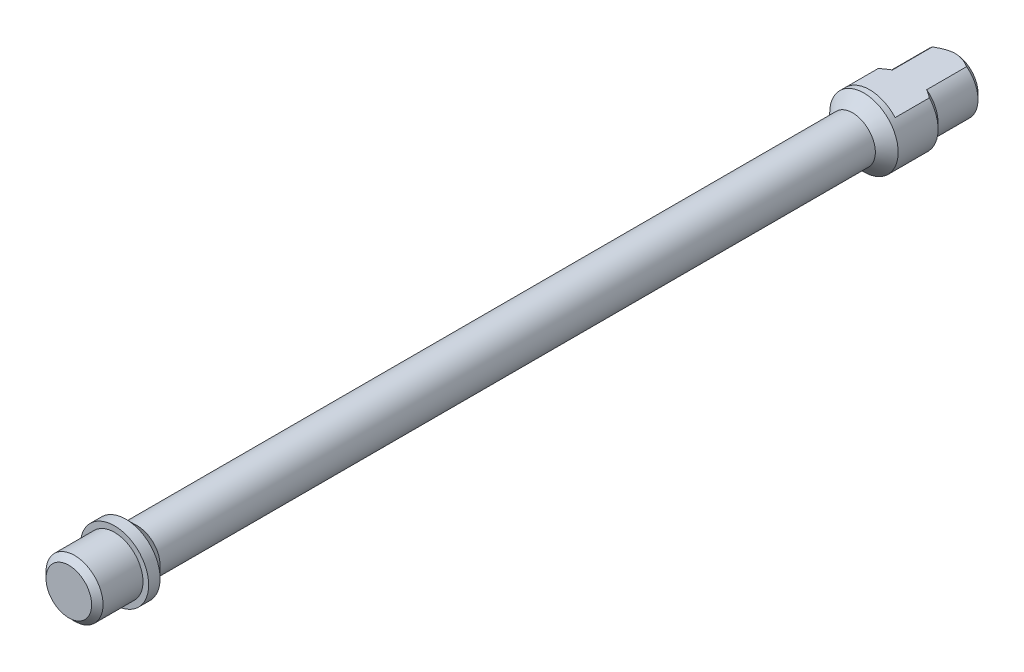
ISO-10303-21;
HEADER;
FILE_DESCRIPTION(('STEP AP214'),'2;1');
FILE_NAME('part.step','',(''),(''),'','','');
FILE_SCHEMA(('AUTOMOTIVE_DESIGN { 1 0 10303 214 1 1 1 1 }'));
ENDSEC;
DATA;
#1=APPLICATION_CONTEXT('core data for automotive mechanical design processes');
#2=APPLICATION_PROTOCOL_DEFINITION('international standard','automotive_design',2000,#1);
#3=PRODUCT_CONTEXT('',#1,'mechanical');
#4=PRODUCT('Part','Part','',(#3));
#5=PRODUCT_RELATED_PRODUCT_CATEGORY('part','',(#4));
#6=PRODUCT_DEFINITION_FORMATION('','',#4);
#7=PRODUCT_DEFINITION_CONTEXT('part definition',#1,'design');
#8=PRODUCT_DEFINITION('design','',#6,#7);
#9=PRODUCT_DEFINITION_SHAPE('','',#8);
#10=(LENGTH_UNIT() NAMED_UNIT(*) SI_UNIT(.MILLI.,.METRE.));
#11=(NAMED_UNIT(*) PLANE_ANGLE_UNIT() SI_UNIT($,.RADIAN.));
#12=(NAMED_UNIT(*) SI_UNIT($,.STERADIAN.) SOLID_ANGLE_UNIT());
#13=UNCERTAINTY_MEASURE_WITH_UNIT(LENGTH_MEASURE(1.E-05),#10,'distance_accuracy_value','');
#14=(GEOMETRIC_REPRESENTATION_CONTEXT(3) GLOBAL_UNCERTAINTY_ASSIGNED_CONTEXT((#13)) GLOBAL_UNIT_ASSIGNED_CONTEXT((#10,
#11,#12)) REPRESENTATION_CONTEXT('',''));
#15=CARTESIAN_POINT('',(0.,0.,0.));
#16=DIRECTION('',(0.,0.,1.));
#17=DIRECTION('',(1.,0.,0.));
#18=AXIS2_PLACEMENT_3D('',#15,#16,#17);
#19=CARTESIAN_POINT('',(0.,0.,33.35));
#20=DIRECTION('',(0.,0.,1.));
#21=DIRECTION('',(1.,0.,0.));
#22=AXIS2_PLACEMENT_3D('',#19,#20,#21);
#23=PLANE('',#22);
#24=CARTESIAN_POINT('',(0.,0.,33.35));
#25=DIRECTION('',(0.,0.,1.));
#26=DIRECTION('',(1.,0.,0.));
#27=AXIS2_PLACEMENT_3D('',#24,#25,#26);
#28=CIRCLE('',#27,3.);
#29=CARTESIAN_POINT('',(3.,0.,33.35));
#30=VERTEX_POINT('',#29);
#31=EDGE_CURVE('E95',#30,#30,#28,.T.);
#32=ORIENTED_EDGE('',*,*,#31,.T.);
#33=EDGE_LOOP('',(#32));
#34=FACE_BOUND('',#33,.T.);
#35=CARTESIAN_POINT('',(0.,0.,33.35));
#36=DIRECTION('',(0.,0.,1.));
#37=DIRECTION('',(1.,0.,0.));
#38=AXIS2_PLACEMENT_3D('',#35,#36,#37);
#39=CIRCLE('',#38,2.5);
#40=CARTESIAN_POINT('',(2.5,0.,33.35));
#41=VERTEX_POINT('',#40);
#42=EDGE_CURVE('E180',#41,#41,#39,.T.);
#43=ORIENTED_EDGE('',*,*,#42,.F.);
#44=EDGE_LOOP('',(#43));
#45=FACE_BOUND('',#44,.T.);
#46=ADVANCED_FACE('F35',(#34,#45),#23,.T.);
#47=CARTESIAN_POINT('',(0.,0.,32.35));
#48=DIRECTION('',(0.,0.,-1.));
#49=DIRECTION('',(-1.,0.,0.));
#50=AXIS2_PLACEMENT_3D('',#47,#48,#49);
#51=CYLINDRICAL_SURFACE('',#50,2.);
#52=CARTESIAN_POINT('',(0.,0.,-31.35));
#53=DIRECTION('',(0.,0.,-1.));
#54=DIRECTION('',(-1.,0.,0.));
#55=AXIS2_PLACEMENT_3D('',#52,#53,#54);
#56=CIRCLE('',#55,2.);
#57=CARTESIAN_POINT('',(-2.,0.,-31.35));
#58=VERTEX_POINT('',#57);
#59=EDGE_CURVE('E11',#58,#58,#56,.F.);
#60=CARTESIAN_POINT('',(0.,0.,31.35));
#61=DIRECTION('',(0.,0.,1.));
#62=DIRECTION('',(1.,0.,0.));
#63=AXIS2_PLACEMENT_3D('',#60,#61,#62);
#64=CIRCLE('',#63,2.);
#65=CARTESIAN_POINT('',(-2.,0.,31.35));
#66=VERTEX_POINT('',#65);
#67=EDGE_CURVE('E43',#66,#66,#64,.F.);
#68=CARTESIAN_POINT('',(-2.,0.,-31.35));
#69=CARTESIAN_POINT('',(-2.,0.,-30.696875));
#70=CARTESIAN_POINT('',(-2.,0.,-30.04375));
#71=CARTESIAN_POINT('',(-2.,0.,-28.7375));
#72=CARTESIAN_POINT('',(-2.,0.,-28.084375));
#73=CARTESIAN_POINT('',(-2.,0.,-26.778125));
#74=CARTESIAN_POINT('',(-2.,0.,-26.125));
#75=CARTESIAN_POINT('',(-2.,0.,-24.81875));
#76=CARTESIAN_POINT('',(-2.,0.,-24.165625));
#77=CARTESIAN_POINT('',(-2.,0.,-22.859375));
#78=CARTESIAN_POINT('',(-2.,0.,-22.20625));
#79=CARTESIAN_POINT('',(-2.,0.,-20.9));
#80=CARTESIAN_POINT('',(-2.,0.,-20.246875));
#81=CARTESIAN_POINT('',(-2.,0.,-18.940625));
#82=CARTESIAN_POINT('',(-2.,0.,-18.2875));
#83=CARTESIAN_POINT('',(-2.,0.,-16.98125));
#84=CARTESIAN_POINT('',(-2.,0.,-16.328125));
#85=CARTESIAN_POINT('',(-2.,0.,-15.021875));
#86=CARTESIAN_POINT('',(-2.,0.,-14.36875));
#87=CARTESIAN_POINT('',(-2.,0.,-13.0625));
#88=CARTESIAN_POINT('',(-2.,0.,-12.409375));
#89=CARTESIAN_POINT('',(-2.,0.,-11.103125));
#90=CARTESIAN_POINT('',(-2.,0.,-10.45));
#91=CARTESIAN_POINT('',(-2.,0.,-9.14375));
#92=CARTESIAN_POINT('',(-2.,0.,-8.490625));
#93=CARTESIAN_POINT('',(-2.,0.,-7.184375));
#94=CARTESIAN_POINT('',(-2.,0.,-6.53125));
#95=CARTESIAN_POINT('',(-2.,0.,-5.225));
#96=CARTESIAN_POINT('',(-2.,0.,-4.571875));
#97=CARTESIAN_POINT('',(-2.,0.,-3.265625));
#98=CARTESIAN_POINT('',(-2.,0.,-2.61249999999999));
#99=CARTESIAN_POINT('',(-2.,0.,-1.30624999999999));
#100=CARTESIAN_POINT('',(-2.,0.,-0.653124999999993));
#101=CARTESIAN_POINT('',(-2.,0.,0.653125000000006));
#102=CARTESIAN_POINT('',(-2.,0.,1.30625));
#103=CARTESIAN_POINT('',(-2.,0.,2.6125));
#104=CARTESIAN_POINT('',(-2.,0.,3.26562500000001));
#105=CARTESIAN_POINT('',(-2.,0.,4.57187500000001));
#106=CARTESIAN_POINT('',(-2.,0.,5.22500000000001));
#107=CARTESIAN_POINT('',(-2.,0.,6.53125000000001));
#108=CARTESIAN_POINT('',(-2.,0.,7.18437500000001));
#109=CARTESIAN_POINT('',(-2.,0.,8.49062500000001));
#110=CARTESIAN_POINT('',(-2.,0.,9.14375000000001));
#111=CARTESIAN_POINT('',(-2.,0.,10.45));
#112=CARTESIAN_POINT('',(-2.,0.,11.103125));
#113=CARTESIAN_POINT('',(-2.,0.,12.409375));
#114=CARTESIAN_POINT('',(-2.,0.,13.0625));
#115=CARTESIAN_POINT('',(-2.,0.,14.36875));
#116=CARTESIAN_POINT('',(-2.,0.,15.021875));
#117=CARTESIAN_POINT('',(-2.,0.,16.328125));
#118=CARTESIAN_POINT('',(-2.,0.,16.98125));
#119=CARTESIAN_POINT('',(-2.,0.,18.2875));
#120=CARTESIAN_POINT('',(-2.,0.,18.940625));
#121=CARTESIAN_POINT('',(-2.,0.,20.246875));
#122=CARTESIAN_POINT('',(-2.,0.,20.9));
#123=CARTESIAN_POINT('',(-2.,0.,22.20625));
#124=CARTESIAN_POINT('',(-2.,0.,22.859375));
#125=CARTESIAN_POINT('',(-2.,0.,24.165625));
#126=CARTESIAN_POINT('',(-2.,0.,24.81875));
#127=CARTESIAN_POINT('',(-2.,0.,26.125));
#128=CARTESIAN_POINT('',(-2.,0.,26.778125));
#129=CARTESIAN_POINT('',(-2.,0.,28.084375));
#130=CARTESIAN_POINT('',(-2.,0.,28.7375));
#131=CARTESIAN_POINT('',(-2.,0.,30.04375));
#132=CARTESIAN_POINT('',(-2.,0.,30.696875));
#133=CARTESIAN_POINT('',(-2.,0.,31.35));
#134=B_SPLINE_CURVE_WITH_KNOTS('',3,(#68,#69,#70,#71,#72,#73,#74,#75,#76,#77,#78,#79,#80,#81,
#82,#83,#84,#85,#86,#87,#88,#89,#90,#91,#92,#93,#94,#95,#96,#97,#98,#99,#100,#101,#102,#103,
#104,#105,#106,#107,#108,#109,#110,#111,#112,#113,#114,#115,#116,#117,#118,#119,#120,#121,#122,
#123,#124,#125,#126,#127,#128,#129,#130,#131,#132,#133),.UNSPECIFIED.,.F.,.F.,(4,2,2,2,2,2,2,2,
2,2,2,2,2,2,2,2,2,2,2,2,2,2,2,2,2,2,2,2,2,2,2,2,4),(0.,1.95937499999999,3.91875,5.878125,7.8375,
9.796875,11.75625,13.715625,15.675,17.634375,19.59375,21.553125,23.5125,25.471875,27.43125,
29.390625,31.35,33.309375,35.26875,37.228125,39.1875,41.146875,43.10625,45.065625,47.025,
48.984375,50.94375,52.903125,54.8625,56.821875,58.78125,60.740625,62.7),.UNSPECIFIED.);
#135=EDGE_CURVE('BSEAM146',#58,#66,#134,.T.);
#136=ORIENTED_EDGE('',*,*,#59,.T.);
#137=ORIENTED_EDGE('',*,*,#67,.T.);
#138=ORIENTED_EDGE('',*,*,#135,.T.);
#139=ORIENTED_EDGE('',*,*,#135,.F.);
#140=EDGE_LOOP('',(#136,#138,#137,#139));
#141=FACE_BOUND('',#140,.T.);
#142=ADVANCED_FACE('F146',(#141),#51,.T.);
#143=CARTESIAN_POINT('',(0.,0.,33.35));
#144=DIRECTION('',(0.,0.,-1.));
#145=DIRECTION('',(-1.,0.,0.));
#146=AXIS2_PLACEMENT_3D('',#143,#144,#145);
#147=CYLINDRICAL_SURFACE('',#146,3.);
#148=ORIENTED_EDGE('',*,*,#31,.F.);
#149=EDGE_LOOP('',(#148));
#150=FACE_BOUND('',#149,.T.);
#151=CARTESIAN_POINT('',(0.,0.,32.35));
#152=DIRECTION('',(0.,0.,1.));
#153=DIRECTION('',(1.,0.,0.));
#154=AXIS2_PLACEMENT_3D('',#151,#152,#153);
#155=CIRCLE('',#154,3.);
#156=CARTESIAN_POINT('',(3.,0.,32.35));
#157=VERTEX_POINT('',#156);
#158=EDGE_CURVE('E100',#157,#157,#155,.T.);
#159=ORIENTED_EDGE('',*,*,#158,.T.);
#160=EDGE_LOOP('',(#159));
#161=FACE_BOUND('',#160,.T.);
#162=ADVANCED_FACE('F162',(#150,#161),#147,.T.);
#163=CARTESIAN_POINT('',(0.,0.,37.35));
#164=DIRECTION('',(0.,0.,-1.));
#165=DIRECTION('',(-1.,0.,0.));
#166=AXIS2_PLACEMENT_3D('',#163,#164,#165);
#167=CYLINDRICAL_SURFACE('',#166,2.5);
#168=CARTESIAN_POINT('',(0.,0.,36.85));
#169=DIRECTION('',(0.,0.,1.));
#170=DIRECTION('',(1.,0.,0.));
#171=AXIS2_PLACEMENT_3D('',#168,#169,#170);
#172=CIRCLE('',#171,2.5);
#173=CARTESIAN_POINT('',(2.5,0.,36.85));
#174=VERTEX_POINT('',#173);
#175=EDGE_CURVE('E106',#174,#174,#172,.F.);
#176=ORIENTED_EDGE('',*,*,#175,.T.);
#177=EDGE_LOOP('',(#176));
#178=FACE_BOUND('',#177,.T.);
#179=ORIENTED_EDGE('',*,*,#42,.T.);
#180=EDGE_LOOP('',(#179));
#181=FACE_BOUND('',#180,.T.);
#182=ADVANCED_FACE('F166',(#178,#181),#167,.T.);
#183=CARTESIAN_POINT('',(0.,0.,37.35));
#184=DIRECTION('',(0.,0.,1.));
#185=DIRECTION('',(1.,0.,0.));
#186=AXIS2_PLACEMENT_3D('',#183,#184,#185);
#187=PLANE('',#186);
#188=CARTESIAN_POINT('',(0.,0.,37.35));
#189=DIRECTION('',(0.,0.,1.));
#190=DIRECTION('',(1.,0.,0.));
#191=AXIS2_PLACEMENT_3D('',#188,#189,#190);
#192=CIRCLE('',#191,1.99999999999999);
#193=CARTESIAN_POINT('',(1.99999999999999,0.,37.35));
#194=VERTEX_POINT('',#193);
#195=EDGE_CURVE('E97',#194,#194,#192,.T.);
#196=ORIENTED_EDGE('',*,*,#195,.T.);
#197=EDGE_LOOP('',(#196));
#198=FACE_BOUND('',#197,.T.);
#199=ADVANCED_FACE('F173',(#198),#187,.T.);
#200=CARTESIAN_POINT('',(0.,0.,-36.35));
#201=DIRECTION('',(0.,0.,1.));
#202=DIRECTION('',(1.,0.,0.));
#203=AXIS2_PLACEMENT_3D('',#200,#201,#202);
#204=CYLINDRICAL_SURFACE('',#203,3.);
#205=CARTESIAN_POINT('',(0.,0.,-35.85));
#206=DIRECTION('',(0.,0.,-1.));
#207=DIRECTION('',(-1.,0.,0.));
#208=AXIS2_PLACEMENT_3D('',#205,#206,#207);
#209=CIRCLE('',#208,3.);
#210=CARTESIAN_POINT('',(-2.23606797749979,2.,-35.85));
#211=VERTEX_POINT('',#210);
#212=CARTESIAN_POINT('',(2.23606797749979,2.,-35.85));
#213=VERTEX_POINT('',#212);
#214=EDGE_CURVE('E109',#211,#213,#209,.F.);
#215=ORIENTED_EDGE('',*,*,#214,.T.);
#216=DIRECTION('',(0.,0.,1.));
#217=VECTOR('',#216,1.);
#218=CARTESIAN_POINT('',(2.23606797749979,2.,-36.35));
#219=LINE('',#218,#217);
#220=CARTESIAN_POINT('',(2.23606797749979,2.,-32.85));
#221=VERTEX_POINT('',#220);
#222=EDGE_CURVE('E57',#213,#221,#219,.T.);
#223=ORIENTED_EDGE('',*,*,#222,.T.);
#224=CARTESIAN_POINT('',(0.,0.,-32.85));
#225=DIRECTION('',(0.,0.,-1.));
#226=DIRECTION('',(-1.,0.,0.));
#227=AXIS2_PLACEMENT_3D('',#224,#225,#226);
#228=CIRCLE('',#227,3.);
#229=CARTESIAN_POINT('',(-2.23606797749979,2.,-32.85));
#230=VERTEX_POINT('',#229);
#231=EDGE_CURVE('E121',#230,#221,#228,.T.);
#232=ORIENTED_EDGE('',*,*,#231,.F.);
#233=DIRECTION('',(0.,0.,1.));
#234=VECTOR('',#233,1.);
#235=CARTESIAN_POINT('',(-2.23606797749979,2.,-36.35));
#236=LINE('',#235,#234);
#237=EDGE_CURVE('E92',#230,#211,#236,.F.);
#238=ORIENTED_EDGE('',*,*,#237,.T.);
#239=EDGE_LOOP('',(#215,#223,#232,#238));
#240=FACE_BOUND('',#239,.T.);
#241=CARTESIAN_POINT('',(0.,0.,-32.35));
#242=DIRECTION('',(0.,0.,-1.));
#243=DIRECTION('',(-1.,0.,0.));
#244=AXIS2_PLACEMENT_3D('',#241,#242,#243);
#245=CIRCLE('',#244,3.);
#246=CARTESIAN_POINT('',(-3.,0.,-32.35));
#247=VERTEX_POINT('',#246);
#248=EDGE_CURVE('E182',#247,#247,#245,.T.);
#249=ORIENTED_EDGE('',*,*,#248,.T.);
#250=EDGE_LOOP('',(#249));
#251=FACE_BOUND('',#250,.T.);
#252=ADVANCED_FACE('F199',(#240,#251),#204,.T.);
#253=CARTESIAN_POINT('',(0.,0.,-40.35));
#254=DIRECTION('',(0.,0.,1.));
#255=DIRECTION('',(1.,0.,0.));
#256=AXIS2_PLACEMENT_3D('',#253,#254,#255);
#257=CYLINDRICAL_SURFACE('',#256,2.5);
#258=CARTESIAN_POINT('',(0.,0.,-39.85));
#259=DIRECTION('',(0.,0.,-1.));
#260=DIRECTION('',(-1.,0.,0.));
#261=AXIS2_PLACEMENT_3D('',#258,#259,#260);
#262=CIRCLE('',#261,2.5);
#263=CARTESIAN_POINT('',(-1.5,2.,-39.85));
#264=VERTEX_POINT('',#263);
#265=CARTESIAN_POINT('',(1.5,2.,-39.85));
#266=VERTEX_POINT('',#265);
#267=EDGE_CURVE('E91',#264,#266,#262,.F.);
#268=ORIENTED_EDGE('',*,*,#267,.T.);
#269=DIRECTION('',(0.,0.,1.));
#270=VECTOR('',#269,1.);
#271=CARTESIAN_POINT('',(1.5,2.,-40.35));
#272=LINE('',#271,#270);
#273=CARTESIAN_POINT('',(1.5,2.,-36.35));
#274=VERTEX_POINT('',#273);
#275=EDGE_CURVE('E82',#266,#274,#272,.T.);
#276=ORIENTED_EDGE('',*,*,#275,.T.);
#277=CARTESIAN_POINT('',(0.,0.,-36.35));
#278=DIRECTION('',(0.,0.,-1.));
#279=DIRECTION('',(-1.,0.,0.));
#280=AXIS2_PLACEMENT_3D('',#277,#278,#279);
#281=CIRCLE('',#280,2.5);
#282=CARTESIAN_POINT('',(-1.5,2.,-36.35));
#283=VERTEX_POINT('',#282);
#284=EDGE_CURVE('E187',#274,#283,#281,.T.);
#285=ORIENTED_EDGE('',*,*,#284,.T.);
#286=DIRECTION('',(0.,0.,1.));
#287=VECTOR('',#286,1.);
#288=CARTESIAN_POINT('',(-1.5,2.,-40.35));
#289=LINE('',#288,#287);
#290=EDGE_CURVE('E50',#283,#264,#289,.F.);
#291=ORIENTED_EDGE('',*,*,#290,.T.);
#292=EDGE_LOOP('',(#268,#276,#285,#291));
#293=FACE_BOUND('',#292,.T.);
#294=ADVANCED_FACE('F195',(#293),#257,.T.);
#295=CARTESIAN_POINT('',(0.,0.,-40.35));
#296=DIRECTION('',(0.,0.,-1.));
#297=DIRECTION('',(-1.,0.,0.));
#298=AXIS2_PLACEMENT_3D('',#295,#296,#297);
#299=PLANE('',#298);
#300=CARTESIAN_POINT('',(0.,0.,-40.35));
#301=DIRECTION('',(0.,0.,-1.));
#302=DIRECTION('',(-1.,0.,0.));
#303=AXIS2_PLACEMENT_3D('',#300,#301,#302);
#304=CIRCLE('',#303,1.99999999999999);
#305=CARTESIAN_POINT('',(0.,2.,-40.35));
#306=VERTEX_POINT('',#305);
#307=EDGE_CURVE('E90',#306,#306,#304,.T.);
#308=ORIENTED_EDGE('',*,*,#307,.T.);
#309=EDGE_LOOP('',(#308));
#310=FACE_BOUND('',#309,.T.);
#311=ADVANCED_FACE('F94',(#310),#299,.T.);
#312=CARTESIAN_POINT('',(0.,0.,-40.35));
#313=DIRECTION('',(0.,0.,1.));
#314=DIRECTION('',(1.,0.,0.));
#315=AXIS2_PLACEMENT_3D('',#312,#313,#314);
#316=CONICAL_SURFACE('',#315,1.99999999999999,0.785398163397446);
#317=CARTESIAN_POINT('',(-4.02524487287732,2.,-37.8552701653353));
#318=CARTESIAN_POINT('',(-3.93338656559502,2.,-37.9375217206694));
#319=CARTESIAN_POINT('',(-3.84126127996533,2.,-38.0194777630484));
#320=CARTESIAN_POINT('',(-3.65633622016192,2.,-38.1826420150682));
#321=CARTESIAN_POINT('',(-3.56353638507522,2.,-38.2638501556328));
#322=CARTESIAN_POINT('',(-3.37679065484129,2.,-38.4256480230057));
#323=CARTESIAN_POINT('',(-3.28284177522376,2.,-38.5062343111819));
#324=CARTESIAN_POINT('',(-3.09396170046438,2.,-38.666241356936));
#325=CARTESIAN_POINT('',(-2.9990305459873,2.,-38.7456621624367));
#326=CARTESIAN_POINT('',(-2.80231868574971,2.,-38.9076618695362));
#327=CARTESIAN_POINT('',(-2.7004639581137,2.,-38.9901511403073));
#328=CARTESIAN_POINT('',(-2.49502065799541,2.,-39.1529394966641));
#329=CARTESIAN_POINT('',(-2.39143218029121,2.,-39.2332387013461));
#330=CARTESIAN_POINT('',(-2.18217141569413,2.,-39.3907552208728));
#331=CARTESIAN_POINT('',(-2.07650249233657,2.,-39.4679769835109));
#332=CARTESIAN_POINT('',(-1.86228016066992,2.,-39.6182890730739));
#333=CARTESIAN_POINT('',(-1.7537276355555,2.,-39.6913806440337));
#334=CARTESIAN_POINT('',(-1.56257875752936,2.,-39.8127220691165));
#335=CARTESIAN_POINT('',(-1.48086803544077,2.,-39.8623596167979));
#336=CARTESIAN_POINT('',(-1.31495821323154,2.,-39.9574104299911));
#337=CARTESIAN_POINT('',(-1.23075822227052,2.,-40.0028221584837));
#338=CARTESIAN_POINT('',(-1.0602390235546,2.,-40.0875500940182));
#339=CARTESIAN_POINT('',(-0.973945152787859,2.,-40.1269166708474));
#340=CARTESIAN_POINT('',(-0.798278775330235,2.,-40.1980658869434));
#341=CARTESIAN_POINT('',(-0.708908734252924,2.,-40.2298544452973));
#342=CARTESIAN_POINT('',(-0.559541387776272,2.,-40.2739554616646));
#343=CARTESIAN_POINT('',(-0.500403045428476,2.,-40.2891736445886));
#344=CARTESIAN_POINT('',(-0.381108626655472,2.,-40.3148450536554));
#345=CARTESIAN_POINT('',(-0.320952978782921,2.,-40.325300236847));
#346=CARTESIAN_POINT('',(-0.200181452597915,2.,-40.3408949804001));
#347=CARTESIAN_POINT('',(-0.139568224383834,2.,-40.3460547746351));
#348=CARTESIAN_POINT('',(-0.0181203079270978,2.,-40.3508382229008));
#349=CARTESIAN_POINT('',(0.0427143780219879,2.,-40.3504619341048));
#350=CARTESIAN_POINT('',(0.163839037596732,2.,-40.344208583769));
#351=CARTESIAN_POINT('',(0.22413022591822,2.,-40.3383546366807));
#352=CARTESIAN_POINT('',(0.34399154744357,2.,-40.3215015109566));
#353=CARTESIAN_POINT('',(0.403561514966868,2.,-40.3105011722532));
#354=CARTESIAN_POINT('',(0.522342234602083,2.,-40.2837349239597));
#355=CARTESIAN_POINT('',(0.581540567552806,2.,-40.2679146042934));
#356=CARTESIAN_POINT('',(0.698671365380822,2.,-40.2322112796639));
#357=CARTESIAN_POINT('',(0.756604050119152,2.,-40.2123289866356));
#358=CARTESIAN_POINT('',(0.887860927745213,2.,-40.1628560581075));
#359=CARTESIAN_POINT('',(0.960752844289923,2.,-40.13212449841));
#360=CARTESIAN_POINT('',(1.10449637010202,2.,-40.0661808969026));
#361=CARTESIAN_POINT('',(1.17534687727418,2.,-40.0309664885297));
#362=CARTESIAN_POINT('',(1.31542984339307,2.,-39.9569247865524));
#363=CARTESIAN_POINT('',(1.38465593395357,2.,-39.9180855391967));
#364=CARTESIAN_POINT('',(1.52149299869853,2.,-39.8376549997551));
#365=CARTESIAN_POINT('',(1.58910373202631,2.,-39.7960633007095));
#366=CARTESIAN_POINT('',(1.71962468526394,2.,-39.712821493367));
#367=CARTESIAN_POINT('',(1.78260199281831,2.,-39.6712760281911));
#368=CARTESIAN_POINT('',(1.90748425118693,2.,-39.5865978718585));
#369=CARTESIAN_POINT('',(1.96938911660695,2.,-39.543465055154));
#370=CARTESIAN_POINT('',(2.09174110166182,2.,-39.4562912155001));
#371=CARTESIAN_POINT('',(2.15219622437861,2.,-39.4122613860916));
#372=CARTESIAN_POINT('',(2.27230748022893,2.,-39.3231570679659));
#373=CARTESIAN_POINT('',(2.33196382265283,2.,-39.2780828616878));
#374=CARTESIAN_POINT('',(2.39129047517803,2.,-39.2325859856803));
#375=B_SPLINE_CURVE_WITH_KNOTS('',3,(#317,#318,#319,#320,#321,#322,#323,#324,#325,#326,#327,
#328,#329,#330,#331,#332,#333,#334,#335,#336,#337,#338,#339,#340,#341,#342,#343,#344,#345,#346,
#347,#348,#349,#350,#351,#352,#353,#354,#355,#356,#357,#358,#359,#360,#361,#362,#363,#364,#365,
#366,#367,#368,#369,#370,#371,#372,#373,#374),.UNSPECIFIED.,.F.,.F.,(4,2,2,2,2,2,2,2,2,2,2,2,2,
2,2,2,2,2,2,2,2,2,2,2,2,2,2,2,4),(0.,0.369906577290637,0.73984698335982,1.11116790415773,
1.48247351382388,1.87565592604999,2.26881691411833,2.66138738129621,3.05383896694483,
3.34056558561759,3.62739608846758,3.91168916131589,4.19575944375504,4.37878987167404,
4.56174502701617,4.74399847152467,4.92625003382965,5.10773598829819,5.28926287192773,
5.47292001224289,5.65654499086521,5.89365897291802,6.1308986541621,6.36895036811942,
6.6070373578473,6.83334806436316,7.05967670901756,7.28403255416345,7.50832841730329),.UNSPECIFIED.);
#376=EDGE_CURVE('E77',#266,#306,#375,.F.);
#377=ORIENTED_EDGE('',*,*,#376,.F.);
#378=ORIENTED_EDGE('',*,*,#267,.F.);
#379=EDGE_CURVE('E80',#306,#264,#375,.F.);
#380=ORIENTED_EDGE('',*,*,#379,.F.);
#381=ORIENTED_EDGE('',*,*,#307,.F.);
#382=EDGE_LOOP('',(#377,#378,#380,#381));
#383=FACE_BOUND('',#382,.T.);
#384=ADVANCED_FACE('F89',(#383),#316,.T.);
#385=CARTESIAN_POINT('',(0.,0.,37.35));
#386=DIRECTION('',(0.,0.,-1.));
#387=DIRECTION('',(-1.,0.,0.));
#388=AXIS2_PLACEMENT_3D('',#385,#386,#387);
#389=CONICAL_SURFACE('',#388,1.99999999999999,0.785398163397446);
#390=ORIENTED_EDGE('',*,*,#175,.F.);
#391=EDGE_LOOP('',(#390));
#392=FACE_BOUND('',#391,.T.);
#393=ORIENTED_EDGE('',*,*,#195,.F.);
#394=EDGE_LOOP('',(#393));
#395=FACE_BOUND('',#394,.T.);
#396=ADVANCED_FACE('F145',(#392,#395),#389,.T.);
#397=CARTESIAN_POINT('',(0.,0.,-36.35));
#398=DIRECTION('',(0.,0.,1.));
#399=DIRECTION('',(1.,0.,0.));
#400=AXIS2_PLACEMENT_3D('',#397,#398,#399);
#401=CONICAL_SURFACE('',#400,2.50000000000002,0.785398163397446);
#402=CARTESIAN_POINT('',(6.30297669939968,2.,-32.2373216263623));
#403=CARTESIAN_POINT('',(6.19161538231918,2.,-32.3434654188677));
#404=CARTESIAN_POINT('',(6.08012784166971,2.,-32.4494766865766));
#405=CARTESIAN_POINT('',(5.85685182740817,2.,-32.6611832346176));
#406=CARTESIAN_POINT('',(5.74506335186332,2.,-32.766878512911));
#407=CARTESIAN_POINT('',(5.40910374007518,2.,-33.0834799534095));
#408=CARTESIAN_POINT('',(5.18441017570402,2.,-33.2938332007284));
#409=CARTESIAN_POINT('',(4.73080338017172,2.,-33.7145130906793));
#410=CARTESIAN_POINT('',(4.50187041839722,2.,-33.9248184834026));
#411=CARTESIAN_POINT('',(4.04109600653748,2.,-34.3421398339185));
#412=CARTESIAN_POINT('',(3.80925519025911,2.,-34.5491564869832));
#413=CARTESIAN_POINT('',(3.41557477398931,2.,-34.8927094339617));
#414=CARTESIAN_POINT('',(3.25498354268553,2.,-35.0306734892414));
#415=CARTESIAN_POINT('',(2.93065759329855,2.,-35.3030414106355));
#416=CARTESIAN_POINT('',(2.76692149007148,2.,-35.4374436429248));
#417=CARTESIAN_POINT('',(2.51812669562768,2.,-35.6346540132489));
#418=CARTESIAN_POINT('',(2.43475662118926,2.,-35.6995897328021));
#419=CARTESIAN_POINT('',(2.26663374732052,2.,-35.8276417312762));
#420=CARTESIAN_POINT('',(2.18188103848765,2.,-35.8907581286649));
#421=CARTESIAN_POINT('',(2.01072574565112,2.,-36.0145933363178));
#422=CARTESIAN_POINT('',(1.92432436509381,2.,-36.0753138031099));
#423=CARTESIAN_POINT('',(1.74941695008943,2.,-36.1936296466813));
#424=CARTESIAN_POINT('',(1.66091137740146,2.,-36.2512257001645));
#425=CARTESIAN_POINT('',(1.502270287322,2.,-36.3492212710429));
#426=CARTESIAN_POINT('',(1.43267637104481,2.,-36.3904935943276));
#427=CARTESIAN_POINT('',(1.29167710661272,2.,-36.4698677964187));
#428=CARTESIAN_POINT('',(1.22027148128104,2.,-36.5079691862348));
#429=CARTESIAN_POINT('',(1.07546452699152,2.,-36.5800460130543));
#430=CARTESIAN_POINT('',(1.00206522711481,2.,-36.6140254658396));
#431=CARTESIAN_POINT('',(0.853081142949114,2.,-36.6767151787812));
#432=CARTESIAN_POINT('',(0.777497091069856,2.,-36.7054271816018));
#433=CARTESIAN_POINT('',(0.584403393214593,2.,-36.7692396638116));
#434=CARTESIAN_POINT('',(0.465352306558762,2.,-36.8000128348776));
#435=CARTESIAN_POINT('',(0.28439755594828,2.,-36.8307588195802));
#436=CARTESIAN_POINT('',(0.223763847529506,2.,-36.838438502314));
#437=CARTESIAN_POINT('',(0.102037460980251,2.,-36.8483151195683));
#438=CARTESIAN_POINT('',(0.0409448065906316,2.,-36.8505123357594));
#439=CARTESIAN_POINT('',(-0.0813412240179869,2.,-36.8492836906337));
#440=CARTESIAN_POINT('',(-0.142534443443026,2.,-36.8458430479095));
#441=CARTESIAN_POINT('',(-0.264365149349687,2.,-36.8335143071468));
#442=CARTESIAN_POINT('',(-0.32500259533621,2.,-36.8246258153165));
#443=CARTESIAN_POINT('',(-0.445513581328063,2.,-36.8018382366568));
#444=CARTESIAN_POINT('',(-0.505384108194607,2.,-36.787923432345));
#445=CARTESIAN_POINT('',(-0.62392046008078,2.,-36.7557165246167));
#446=CARTESIAN_POINT('',(-0.682586214925825,2.,-36.7374241670009));
#447=CARTESIAN_POINT('',(-0.870096679141496,2.,-36.6723195036355));
#448=CARTESIAN_POINT('',(-0.996380524334743,2.,-36.6181300929727));
#449=CARTESIAN_POINT('',(-1.24305957355029,2.,-36.4976478589649));
#450=CARTESIAN_POINT('',(-1.363442360077,2.,-36.4313307945582));
#451=CARTESIAN_POINT('',(-1.60114682986086,2.,-36.2898352181217));
#452=CARTESIAN_POINT('',(-1.71840078274332,2.,-36.2145442578527));
#453=CARTESIAN_POINT('',(-1.89143789202119,2.,-36.0975913945841));
#454=CARTESIAN_POINT('',(-1.94861845845237,2.,-36.0579559985789));
#455=CARTESIAN_POINT('',(-2.06217670530476,2.,-35.9775512752209));
#456=CARTESIAN_POINT('',(-2.11855440502154,2.,-35.9367819751893));
#457=CARTESIAN_POINT('',(-2.27151937990451,2.,-35.824196769287));
#458=CARTESIAN_POINT('',(-2.36741546158166,2.,-35.7514431443246));
#459=CARTESIAN_POINT('',(-2.55757734840232,2.,-35.6038303699529));
#460=CARTESIAN_POINT('',(-2.65184301372996,2.,-35.5289710414011));
#461=CARTESIAN_POINT('',(-2.83909574994458,2.,-35.3776197624691));
#462=CARTESIAN_POINT('',(-2.93208245025616,2.,-35.3011273546395));
#463=CARTESIAN_POINT('',(-3.11700238327257,2.,-35.1468779319394));
#464=CARTESIAN_POINT('',(-3.20893558912928,2.,-35.0691208849615));
#465=CARTESIAN_POINT('',(-3.48375900151844,2.,-34.8340952575393));
#466=CARTESIAN_POINT('',(-3.66536407471735,2.,-34.6753249307297));
#467=CARTESIAN_POINT('',(-4.0261974813524,2.,-34.3551814767042));
#468=CARTESIAN_POINT('',(-4.20542620770821,2.,-34.1938087898096));
#469=CARTESIAN_POINT('',(-4.54602117157569,2.,-33.883936581731));
#470=CARTESIAN_POINT('',(-4.70753312366636,2.,-33.7355969838316));
#471=CARTESIAN_POINT('',(-5.02950930464932,2.,-33.4377703518185));
#472=CARTESIAN_POINT('',(-5.18997348014396,2.,-33.288283260057));
#473=CARTESIAN_POINT('',(-5.50956314093422,2.,-32.9889288168519));
#474=CARTESIAN_POINT('',(-5.66869128700743,2.,-32.8390643030356));
#475=CARTESIAN_POINT('',(-5.98628664721589,2.,-32.5386586900714));
#476=CARTESIAN_POINT('',(-6.14475390713846,2.,-32.3881176393484));
#477=CARTESIAN_POINT('',(-6.30297669939968,2.,-32.2373216263623));
#478=B_SPLINE_CURVE_WITH_KNOTS('',3,(#402,#403,#404,#405,#406,#407,#408,#409,#410,#411,#412,
#413,#414,#415,#416,#417,#418,#419,#420,#421,#422,#423,#424,#425,#426,#427,#428,#429,#430,#431,
#432,#433,#434,#435,#436,#437,#438,#439,#440,#441,#442,#443,#444,#445,#446,#447,#448,#449,#450,
#451,#452,#453,#454,#455,#456,#457,#458,#459,#460,#461,#462,#463,#464,#465,#466,#467,#468,#469,
#470,#471,#472,#473,#474,#475,#476,#477),.UNSPECIFIED.,.F.,.F.,(4,2,2,2,2,2,2,2,2,2,2,2,2,2,2,2,
2,2,2,2,2,2,2,2,2,2,2,2,2,2,2,2,2,2,2,2,2,4),(0.,0.46153039584807,0.923063762999831,
1.84642814570779,2.7790149413771,3.71140188239741,4.34652018448136,4.98192494520127,
5.29893184459039,5.6159180548002,5.9326811193618,6.24937530133099,6.49204579715627,
6.7347536461727,6.97722310585574,7.21961220258095,7.58685502448722,7.76999772547684,
7.95313101701505,8.13674521833654,8.32037269357646,8.50457942200898,8.68879684970661,
9.0999132778532,9.51186062067,9.92965689883889,10.1383717107002,10.3470814979545,
10.7081519451169,11.0692532037656,11.4304569749129,11.7916699308902,12.5152929670805,
13.2387948242448,13.8966755650346,14.5545895756196,15.2103542781077,15.8660727671492),.UNSPECIFIED.);
#479=EDGE_CURVE('E120',#213,#274,#478,.T.);
#480=ORIENTED_EDGE('',*,*,#479,.F.);
#481=ORIENTED_EDGE('',*,*,#214,.F.);
#482=EDGE_CURVE('E112',#283,#211,#478,.T.);
#483=ORIENTED_EDGE('',*,*,#482,.F.);
#484=ORIENTED_EDGE('',*,*,#284,.F.);
#485=EDGE_LOOP('',(#480,#481,#483,#484));
#486=FACE_BOUND('',#485,.T.);
#487=ADVANCED_FACE('F122',(#486),#401,.T.);
#488=CARTESIAN_POINT('',(3.,2.,-32.85));
#489=DIRECTION('',(0.,0.,-1.));
#490=DIRECTION('',(-1.,0.,0.));
#491=AXIS2_PLACEMENT_3D('',#488,#489,#490);
#492=PLANE('',#491);
#493=ORIENTED_EDGE('',*,*,#231,.T.);
#494=DIRECTION('',(-1.,0.,0.));
#495=VECTOR('',#494,1.);
#496=CARTESIAN_POINT('',(3.,2.,-32.85));
#497=LINE('',#496,#495);
#498=EDGE_CURVE('E201',#221,#230,#497,.T.);
#499=ORIENTED_EDGE('',*,*,#498,.T.);
#500=EDGE_LOOP('',(#493,#499));
#501=FACE_BOUND('',#500,.T.);
#502=ADVANCED_FACE('F130',(#501),#492,.T.);
#503=CARTESIAN_POINT('',(3.,2.,-32.85));
#504=DIRECTION('',(0.,-1.,0.));
#505=DIRECTION('',(0.,0.,-1.));
#506=AXIS2_PLACEMENT_3D('',#503,#504,#505);
#507=PLANE('',#506);
#508=ORIENTED_EDGE('',*,*,#479,.T.);
#509=ORIENTED_EDGE('',*,*,#275,.F.);
#510=ORIENTED_EDGE('',*,*,#376,.T.);
#511=ORIENTED_EDGE('',*,*,#379,.T.);
#512=ORIENTED_EDGE('',*,*,#290,.F.);
#513=ORIENTED_EDGE('',*,*,#482,.T.);
#514=ORIENTED_EDGE('',*,*,#237,.F.);
#515=ORIENTED_EDGE('',*,*,#498,.F.);
#516=ORIENTED_EDGE('',*,*,#222,.F.);
#517=EDGE_LOOP('',(#508,#509,#510,#511,#512,#513,#514,#515,#516));
#518=FACE_BOUND('',#517,.T.);
#519=ADVANCED_FACE('F79',(#518),#507,.F.);
#520=CARTESIAN_POINT('',(0.,0.,-32.35));
#521=DIRECTION('',(0.,0.,-1.));
#522=DIRECTION('',(-1.,0.,0.));
#523=AXIS2_PLACEMENT_3D('',#520,#521,#522);
#524=CONICAL_SURFACE('',#523,2.99999999999998,0.785398163397446);
#525=ORIENTED_EDGE('',*,*,#59,.F.);
#526=EDGE_LOOP('',(#525));
#527=FACE_BOUND('',#526,.T.);
#528=ORIENTED_EDGE('',*,*,#248,.F.);
#529=EDGE_LOOP('',(#528));
#530=FACE_BOUND('',#529,.T.);
#531=ADVANCED_FACE('F129',(#527,#530),#524,.T.);
#532=CARTESIAN_POINT('',(0.,0.,32.35));
#533=DIRECTION('',(0.,0.,1.));
#534=DIRECTION('',(1.,0.,0.));
#535=AXIS2_PLACEMENT_3D('',#532,#533,#534);
#536=CONICAL_SURFACE('',#535,2.99999999999997,0.785398163397452);
#537=ORIENTED_EDGE('',*,*,#67,.F.);
#538=EDGE_LOOP('',(#537));
#539=FACE_BOUND('',#538,.T.);
#540=ORIENTED_EDGE('',*,*,#158,.F.);
#541=EDGE_LOOP('',(#540));
#542=FACE_BOUND('',#541,.T.);
#543=ADVANCED_FACE('F37',(#539,#542),#536,.T.);
#544=CLOSED_SHELL('',(#46,#142,#162,#182,#199,#252,#294,#311,#384,#396,#487,#502,#519,#531,#543));
#545=MANIFOLD_SOLID_BREP('B2',#544);
#546=ADVANCED_BREP_SHAPE_REPRESENTATION('',(#18,#545),#14);
#547=SHAPE_DEFINITION_REPRESENTATION(#9,#546);
ENDSEC;
END-ISO-10303-21;
